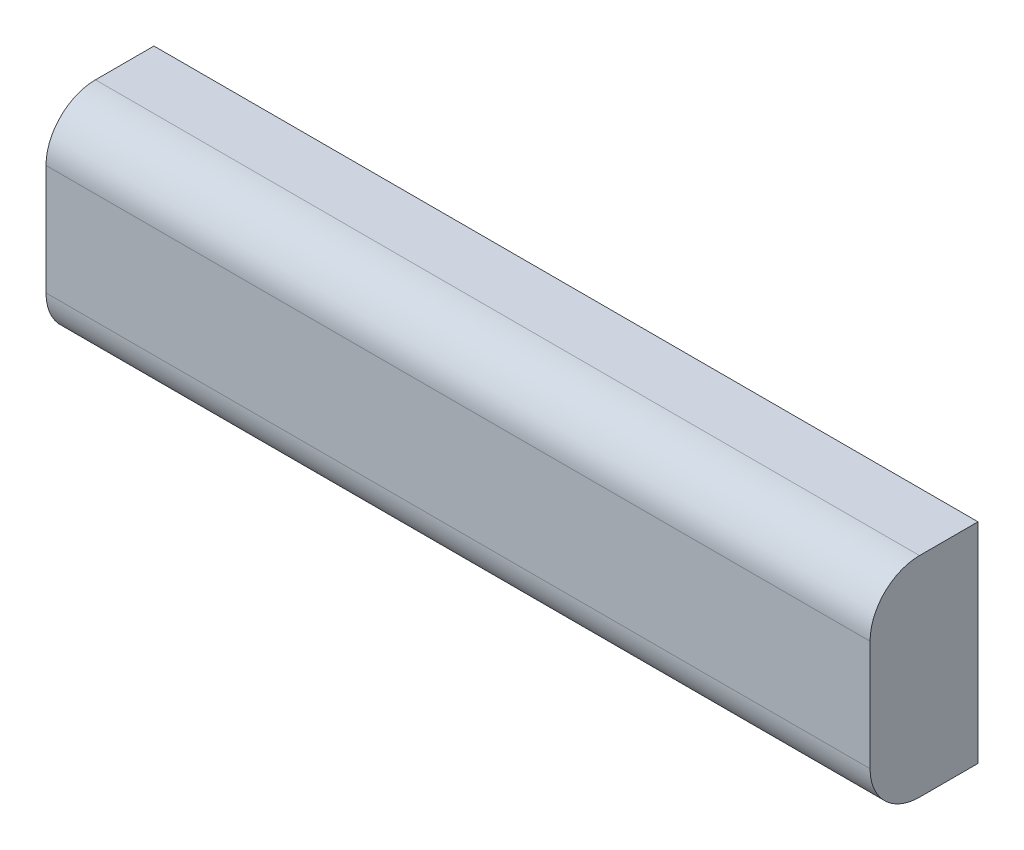
ISO-10303-21;
HEADER;
FILE_DESCRIPTION(('STEP AP214'),'2;1');
FILE_NAME('part.step','',(''),(''),'','','');
FILE_SCHEMA(('AUTOMOTIVE_DESIGN { 1 0 10303 214 1 1 1 1 }'));
ENDSEC;
DATA;
#1=APPLICATION_CONTEXT('core data for automotive mechanical design processes');
#2=APPLICATION_PROTOCOL_DEFINITION('international standard','automotive_design',2000,#1);
#3=PRODUCT_CONTEXT('',#1,'mechanical');
#4=PRODUCT('Part','Part','',(#3));
#5=PRODUCT_RELATED_PRODUCT_CATEGORY('part','',(#4));
#6=PRODUCT_DEFINITION_FORMATION('','',#4);
#7=PRODUCT_DEFINITION_CONTEXT('part definition',#1,'design');
#8=PRODUCT_DEFINITION('design','',#6,#7);
#9=PRODUCT_DEFINITION_SHAPE('','',#8);
#10=(LENGTH_UNIT() NAMED_UNIT(*) SI_UNIT(.MILLI.,.METRE.));
#11=(NAMED_UNIT(*) PLANE_ANGLE_UNIT() SI_UNIT($,.RADIAN.));
#12=(NAMED_UNIT(*) SI_UNIT($,.STERADIAN.) SOLID_ANGLE_UNIT());
#13=UNCERTAINTY_MEASURE_WITH_UNIT(LENGTH_MEASURE(1.E-05),#10,'distance_accuracy_value','');
#14=(GEOMETRIC_REPRESENTATION_CONTEXT(3) GLOBAL_UNCERTAINTY_ASSIGNED_CONTEXT((#13)) GLOBAL_UNIT_ASSIGNED_CONTEXT((#10,
#11,#12)) REPRESENTATION_CONTEXT('',''));
#15=CARTESIAN_POINT('',(0.,0.,0.));
#16=DIRECTION('',(0.,0.,1.));
#17=DIRECTION('',(1.,0.,0.));
#18=AXIS2_PLACEMENT_3D('',#15,#16,#17);
#19=CARTESIAN_POINT('',(-25.,-6.35,6.55));
#20=DIRECTION('',(1.,0.,0.));
#21=DIRECTION('',(0.,0.,-1.));
#22=AXIS2_PLACEMENT_3D('',#19,#20,#21);
#23=PLANE('',#22);
#24=DIRECTION('',(0.,0.,-1.));
#25=VECTOR('',#24,1.);
#26=CARTESIAN_POINT('',(-25.,-6.35,6.55));
#27=LINE('',#26,#25);
#28=CARTESIAN_POINT('',(-25.,-6.35,3.55));
#29=VERTEX_POINT('',#28);
#30=CARTESIAN_POINT('',(-25.,-6.35,0.));
#31=VERTEX_POINT('',#30);
#32=EDGE_CURVE('E176',#29,#31,#27,.T.);
#33=ORIENTED_EDGE('',*,*,#32,.F.);
#34=CARTESIAN_POINT('',(-25.,-3.35,3.55));
#35=DIRECTION('',(1.,0.,0.));
#36=DIRECTION('',(0.,0.,-1.));
#37=AXIS2_PLACEMENT_3D('',#34,#35,#36);
#38=CIRCLE('',#37,3.);
#39=CARTESIAN_POINT('',(-25.,-3.35000000000001,6.55));
#40=VERTEX_POINT('',#39);
#41=EDGE_CURVE('E41',#29,#40,#38,.F.);
#42=ORIENTED_EDGE('',*,*,#41,.T.);
#43=DIRECTION('',(0.,-1.,0.));
#44=VECTOR('',#43,1.);
#45=CARTESIAN_POINT('',(-25.,-6.35,6.55));
#46=LINE('',#45,#44);
#47=CARTESIAN_POINT('',(-25.,3.34999999999999,6.55));
#48=VERTEX_POINT('',#47);
#49=EDGE_CURVE('E153',#48,#40,#46,.T.);
#50=ORIENTED_EDGE('',*,*,#49,.F.);
#51=CARTESIAN_POINT('',(-25.,3.35,3.55));
#52=DIRECTION('',(1.,0.,0.));
#53=DIRECTION('',(0.,0.,-1.));
#54=AXIS2_PLACEMENT_3D('',#51,#52,#53);
#55=CIRCLE('',#54,3.);
#56=CARTESIAN_POINT('',(-25.,6.35,3.55));
#57=VERTEX_POINT('',#56);
#58=EDGE_CURVE('E48',#48,#57,#55,.F.);
#59=ORIENTED_EDGE('',*,*,#58,.T.);
#60=DIRECTION('',(0.,0.,-1.));
#61=VECTOR('',#60,1.);
#62=CARTESIAN_POINT('',(-25.,6.35,6.55));
#63=LINE('',#62,#61);
#64=CARTESIAN_POINT('',(-25.,6.35,0.));
#65=VERTEX_POINT('',#64);
#66=EDGE_CURVE('E160',#57,#65,#63,.T.);
#67=ORIENTED_EDGE('',*,*,#66,.T.);
#68=DIRECTION('',(0.,-1.,0.));
#69=VECTOR('',#68,1.);
#70=CARTESIAN_POINT('',(-25.,-6.35,0.));
#71=LINE('',#70,#69);
#72=EDGE_CURVE('E149',#65,#31,#71,.T.);
#73=ORIENTED_EDGE('',*,*,#72,.T.);
#74=EDGE_LOOP('',(#33,#42,#50,#59,#67,#73));
#75=FACE_BOUND('',#74,.T.);
#76=ADVANCED_FACE('F33',(#75),#23,.F.);
#77=CARTESIAN_POINT('',(25.,-6.35,6.55));
#78=DIRECTION('',(0.,1.,0.));
#79=DIRECTION('',(-1.,0.,0.));
#80=AXIS2_PLACEMENT_3D('',#77,#78,#79);
#81=PLANE('',#80);
#82=DIRECTION('',(0.,0.,-1.));
#83=VECTOR('',#82,1.);
#84=CARTESIAN_POINT('',(25.,-6.35,6.55));
#85=LINE('',#84,#83);
#86=CARTESIAN_POINT('',(25.,-6.35,3.55));
#87=VERTEX_POINT('',#86);
#88=CARTESIAN_POINT('',(25.,-6.35,0.));
#89=VERTEX_POINT('',#88);
#90=EDGE_CURVE('E174',#87,#89,#85,.T.);
#91=ORIENTED_EDGE('',*,*,#90,.F.);
#92=DIRECTION('',(1.,0.,0.));
#93=VECTOR('',#92,1.);
#94=CARTESIAN_POINT('',(-25.,-6.35,3.55));
#95=LINE('',#94,#93);
#96=EDGE_CURVE('E56',#87,#29,#95,.F.);
#97=ORIENTED_EDGE('',*,*,#96,.T.);
#98=ORIENTED_EDGE('',*,*,#32,.T.);
#99=DIRECTION('',(1.,0.,0.));
#100=VECTOR('',#99,1.);
#101=CARTESIAN_POINT('',(25.,-6.35,0.));
#102=LINE('',#101,#100);
#103=EDGE_CURVE('E163',#31,#89,#102,.T.);
#104=ORIENTED_EDGE('',*,*,#103,.T.);
#105=EDGE_LOOP('',(#91,#97,#98,#104));
#106=FACE_BOUND('',#105,.T.);
#107=ADVANCED_FACE('F199',(#106),#81,.F.);
#108=CARTESIAN_POINT('',(25.,-6.35,6.55));
#109=DIRECTION('',(-1.,0.,0.));
#110=DIRECTION('',(0.,0.,1.));
#111=AXIS2_PLACEMENT_3D('',#108,#109,#110);
#112=PLANE('',#111);
#113=DIRECTION('',(0.,1.,0.));
#114=VECTOR('',#113,1.);
#115=CARTESIAN_POINT('',(25.,-6.35,6.55));
#116=LINE('',#115,#114);
#117=CARTESIAN_POINT('',(25.,-3.35,6.55));
#118=VERTEX_POINT('',#117);
#119=CARTESIAN_POINT('',(25.,3.35,6.55));
#120=VERTEX_POINT('',#119);
#121=EDGE_CURVE('E156',#118,#120,#116,.T.);
#122=ORIENTED_EDGE('',*,*,#121,.F.);
#123=CARTESIAN_POINT('',(25.,-3.35,3.55));
#124=DIRECTION('',(-1.,0.,0.));
#125=DIRECTION('',(0.,0.,1.));
#126=AXIS2_PLACEMENT_3D('',#123,#124,#125);
#127=CIRCLE('',#126,3.);
#128=EDGE_CURVE('E186',#118,#87,#127,.F.);
#129=ORIENTED_EDGE('',*,*,#128,.T.);
#130=ORIENTED_EDGE('',*,*,#90,.T.);
#131=DIRECTION('',(0.,1.,0.));
#132=VECTOR('',#131,1.);
#133=CARTESIAN_POINT('',(25.,-6.35,0.));
#134=LINE('',#133,#132);
#135=CARTESIAN_POINT('',(25.,6.35,0.));
#136=VERTEX_POINT('',#135);
#137=EDGE_CURVE('E166',#89,#136,#134,.T.);
#138=ORIENTED_EDGE('',*,*,#137,.T.);
#139=DIRECTION('',(0.,0.,-1.));
#140=VECTOR('',#139,1.);
#141=CARTESIAN_POINT('',(25.,6.35,6.55));
#142=LINE('',#141,#140);
#143=CARTESIAN_POINT('',(25.,6.35,3.55));
#144=VERTEX_POINT('',#143);
#145=EDGE_CURVE('E172',#144,#136,#142,.T.);
#146=ORIENTED_EDGE('',*,*,#145,.F.);
#147=CARTESIAN_POINT('',(25.,3.35,3.55));
#148=DIRECTION('',(-1.,0.,0.));
#149=DIRECTION('',(0.,0.,1.));
#150=AXIS2_PLACEMENT_3D('',#147,#148,#149);
#151=CIRCLE('',#150,3.);
#152=EDGE_CURVE('E184',#144,#120,#151,.F.);
#153=ORIENTED_EDGE('',*,*,#152,.T.);
#154=EDGE_LOOP('',(#122,#129,#130,#138,#146,#153));
#155=FACE_BOUND('',#154,.T.);
#156=ADVANCED_FACE('F198',(#155),#112,.F.);
#157=CARTESIAN_POINT('',(25.,6.35,6.55));
#158=DIRECTION('',(0.,-1.,0.));
#159=DIRECTION('',(1.,0.,0.));
#160=AXIS2_PLACEMENT_3D('',#157,#158,#159);
#161=PLANE('',#160);
#162=ORIENTED_EDGE('',*,*,#66,.F.);
#163=DIRECTION('',(-1.,0.,0.));
#164=VECTOR('',#163,1.);
#165=CARTESIAN_POINT('',(25.,6.35,3.55));
#166=LINE('',#165,#164);
#167=EDGE_CURVE('E11',#57,#144,#166,.F.);
#168=ORIENTED_EDGE('',*,*,#167,.T.);
#169=ORIENTED_EDGE('',*,*,#145,.T.);
#170=DIRECTION('',(-1.,0.,0.));
#171=VECTOR('',#170,1.);
#172=CARTESIAN_POINT('',(25.,6.35,0.));
#173=LINE('',#172,#171);
#174=EDGE_CURVE('E157',#136,#65,#173,.T.);
#175=ORIENTED_EDGE('',*,*,#174,.T.);
#176=EDGE_LOOP('',(#162,#168,#169,#175));
#177=FACE_BOUND('',#176,.T.);
#178=ADVANCED_FACE('F211',(#177),#161,.F.);
#179=CARTESIAN_POINT('',(0.,0.,6.55));
#180=DIRECTION('',(0.,0.,1.));
#181=DIRECTION('',(1.,0.,0.));
#182=AXIS2_PLACEMENT_3D('',#179,#180,#181);
#183=PLANE('',#182);
#184=ORIENTED_EDGE('',*,*,#49,.T.);
#185=DIRECTION('',(1.,0.,0.));
#186=VECTOR('',#185,1.);
#187=CARTESIAN_POINT('',(25.,-3.35,6.55));
#188=LINE('',#187,#186);
#189=EDGE_CURVE('E181',#40,#118,#188,.T.);
#190=ORIENTED_EDGE('',*,*,#189,.T.);
#191=ORIENTED_EDGE('',*,*,#121,.T.);
#192=DIRECTION('',(-1.,0.,0.));
#193=VECTOR('',#192,1.);
#194=CARTESIAN_POINT('',(-25.,3.35,6.55));
#195=LINE('',#194,#193);
#196=EDGE_CURVE('E178',#120,#48,#195,.T.);
#197=ORIENTED_EDGE('',*,*,#196,.T.);
#198=EDGE_LOOP('',(#184,#190,#191,#197));
#199=FACE_BOUND('',#198,.T.);
#200=ADVANCED_FACE('F193',(#199),#183,.T.);
#201=CARTESIAN_POINT('',(0.,0.,0.));
#202=DIRECTION('',(0.,0.,1.));
#203=DIRECTION('',(1.,0.,0.));
#204=AXIS2_PLACEMENT_3D('',#201,#202,#203);
#205=PLANE('',#204);
#206=DIRECTION('',(-1.,0.,0.));
#207=VECTOR('',#206,1.);
#208=CARTESIAN_POINT('',(-24.,-3.16,0.));
#209=LINE('',#208,#207);
#210=CARTESIAN_POINT('',(24.,-3.16,0.));
#211=VERTEX_POINT('',#210);
#212=CARTESIAN_POINT('',(-24.,-3.16,0.));
#213=VERTEX_POINT('',#212);
#214=EDGE_CURVE('E143',#211,#213,#209,.T.);
#215=ORIENTED_EDGE('',*,*,#214,.F.);
#216=DIRECTION('',(0.,-1.,0.));
#217=VECTOR('',#216,1.);
#218=CARTESIAN_POINT('',(24.,-3.16,0.));
#219=LINE('',#218,#217);
#220=CARTESIAN_POINT('',(24.,3.16,0.));
#221=VERTEX_POINT('',#220);
#222=EDGE_CURVE('E117',#221,#211,#219,.T.);
#223=ORIENTED_EDGE('',*,*,#222,.F.);
#224=DIRECTION('',(1.,0.,0.));
#225=VECTOR('',#224,1.);
#226=CARTESIAN_POINT('',(-24.,3.16,0.));
#227=LINE('',#226,#225);
#228=CARTESIAN_POINT('',(-24.,3.16,0.));
#229=VERTEX_POINT('',#228);
#230=EDGE_CURVE('E134',#229,#221,#227,.T.);
#231=ORIENTED_EDGE('',*,*,#230,.F.);
#232=DIRECTION('',(0.,1.,0.));
#233=VECTOR('',#232,1.);
#234=CARTESIAN_POINT('',(-24.,-3.16,0.));
#235=LINE('',#234,#233);
#236=EDGE_CURVE('E137',#213,#229,#235,.T.);
#237=ORIENTED_EDGE('',*,*,#236,.F.);
#238=EDGE_LOOP('',(#215,#223,#231,#237));
#239=FACE_BOUND('',#238,.T.);
#240=ORIENTED_EDGE('',*,*,#72,.F.);
#241=ORIENTED_EDGE('',*,*,#174,.F.);
#242=ORIENTED_EDGE('',*,*,#137,.F.);
#243=ORIENTED_EDGE('',*,*,#103,.F.);
#244=EDGE_LOOP('',(#240,#241,#242,#243));
#245=FACE_BOUND('',#244,.T.);
#246=ADVANCED_FACE('F205',(#239,#245),#205,.F.);
#247=CARTESIAN_POINT('',(24.,-3.16,6.35));
#248=DIRECTION('',(1.,0.,0.));
#249=DIRECTION('',(0.,0.,-1.));
#250=AXIS2_PLACEMENT_3D('',#247,#248,#249);
#251=PLANE('',#250);
#252=ORIENTED_EDGE('',*,*,#222,.T.);
#253=DIRECTION('',(0.,0.,-1.));
#254=VECTOR('',#253,1.);
#255=CARTESIAN_POINT('',(24.,-3.16,6.35));
#256=LINE('',#255,#254);
#257=CARTESIAN_POINT('',(24.,-3.16,6.35));
#258=VERTEX_POINT('',#257);
#259=EDGE_CURVE('E110',#258,#211,#256,.T.);
#260=ORIENTED_EDGE('',*,*,#259,.F.);
#261=DIRECTION('',(0.,-1.,0.));
#262=VECTOR('',#261,1.);
#263=CARTESIAN_POINT('',(24.,-3.16,6.35));
#264=LINE('',#263,#262);
#265=CARTESIAN_POINT('',(24.,3.16,6.35));
#266=VERTEX_POINT('',#265);
#267=EDGE_CURVE('E114',#266,#258,#264,.T.);
#268=ORIENTED_EDGE('',*,*,#267,.F.);
#269=DIRECTION('',(0.,0.,-1.));
#270=VECTOR('',#269,1.);
#271=CARTESIAN_POINT('',(24.,3.16,6.35));
#272=LINE('',#271,#270);
#273=EDGE_CURVE('E147',#266,#221,#272,.T.);
#274=ORIENTED_EDGE('',*,*,#273,.T.);
#275=EDGE_LOOP('',(#252,#260,#268,#274));
#276=FACE_BOUND('',#275,.T.);
#277=ADVANCED_FACE('F112',(#276),#251,.F.);
#278=CARTESIAN_POINT('',(-24.,3.16,6.35));
#279=DIRECTION('',(0.,1.,0.));
#280=DIRECTION('',(-1.,0.,0.));
#281=AXIS2_PLACEMENT_3D('',#278,#279,#280);
#282=PLANE('',#281);
#283=ORIENTED_EDGE('',*,*,#230,.T.);
#284=ORIENTED_EDGE('',*,*,#273,.F.);
#285=DIRECTION('',(1.,0.,0.));
#286=VECTOR('',#285,1.);
#287=CARTESIAN_POINT('',(-24.,3.16,6.35));
#288=LINE('',#287,#286);
#289=CARTESIAN_POINT('',(-24.,3.16,6.35));
#290=VERTEX_POINT('',#289);
#291=EDGE_CURVE('E122',#290,#266,#288,.T.);
#292=ORIENTED_EDGE('',*,*,#291,.F.);
#293=DIRECTION('',(0.,0.,-1.));
#294=VECTOR('',#293,1.);
#295=CARTESIAN_POINT('',(-24.,3.16,6.35));
#296=LINE('',#295,#294);
#297=EDGE_CURVE('E150',#290,#229,#296,.T.);
#298=ORIENTED_EDGE('',*,*,#297,.T.);
#299=EDGE_LOOP('',(#283,#284,#292,#298));
#300=FACE_BOUND('',#299,.T.);
#301=ADVANCED_FACE('F239',(#300),#282,.F.);
#302=CARTESIAN_POINT('',(-24.,-3.16,6.35));
#303=DIRECTION('',(-1.,0.,0.));
#304=DIRECTION('',(0.,0.,1.));
#305=AXIS2_PLACEMENT_3D('',#302,#303,#304);
#306=PLANE('',#305);
#307=ORIENTED_EDGE('',*,*,#236,.T.);
#308=ORIENTED_EDGE('',*,*,#297,.F.);
#309=DIRECTION('',(0.,1.,0.));
#310=VECTOR('',#309,1.);
#311=CARTESIAN_POINT('',(-24.,-3.16,6.35));
#312=LINE('',#311,#310);
#313=CARTESIAN_POINT('',(-24.,-3.16,6.35));
#314=VERTEX_POINT('',#313);
#315=EDGE_CURVE('E130',#314,#290,#312,.T.);
#316=ORIENTED_EDGE('',*,*,#315,.F.);
#317=DIRECTION('',(0.,0.,-1.));
#318=VECTOR('',#317,1.);
#319=CARTESIAN_POINT('',(-24.,-3.16,6.35));
#320=LINE('',#319,#318);
#321=EDGE_CURVE('E121',#314,#213,#320,.T.);
#322=ORIENTED_EDGE('',*,*,#321,.T.);
#323=EDGE_LOOP('',(#307,#308,#316,#322));
#324=FACE_BOUND('',#323,.T.);
#325=ADVANCED_FACE('F236',(#324),#306,.F.);
#326=CARTESIAN_POINT('',(-24.,-3.16,6.35));
#327=DIRECTION('',(0.,-1.,0.));
#328=DIRECTION('',(1.,0.,0.));
#329=AXIS2_PLACEMENT_3D('',#326,#327,#328);
#330=PLANE('',#329);
#331=ORIENTED_EDGE('',*,*,#214,.T.);
#332=ORIENTED_EDGE('',*,*,#321,.F.);
#333=DIRECTION('',(-1.,0.,0.));
#334=VECTOR('',#333,1.);
#335=CARTESIAN_POINT('',(-24.,-3.16,6.35));
#336=LINE('',#335,#334);
#337=EDGE_CURVE('E125',#258,#314,#336,.T.);
#338=ORIENTED_EDGE('',*,*,#337,.F.);
#339=ORIENTED_EDGE('',*,*,#259,.T.);
#340=EDGE_LOOP('',(#331,#332,#338,#339));
#341=FACE_BOUND('',#340,.T.);
#342=ADVANCED_FACE('F126',(#341),#330,.F.);
#343=CARTESIAN_POINT('',(0.,0.,6.35));
#344=DIRECTION('',(0.,0.,-1.));
#345=DIRECTION('',(-1.,0.,0.));
#346=AXIS2_PLACEMENT_3D('',#343,#344,#345);
#347=PLANE('',#346);
#348=ORIENTED_EDGE('',*,*,#267,.T.);
#349=ORIENTED_EDGE('',*,*,#337,.T.);
#350=ORIENTED_EDGE('',*,*,#315,.T.);
#351=ORIENTED_EDGE('',*,*,#291,.T.);
#352=EDGE_LOOP('',(#348,#349,#350,#351));
#353=FACE_BOUND('',#352,.T.);
#354=ADVANCED_FACE('F132',(#353),#347,.T.);
#355=CARTESIAN_POINT('',(0.,-3.35,3.55));
#356=DIRECTION('',(-1.,0.,0.));
#357=DIRECTION('',(0.,-1.,0.));
#358=AXIS2_PLACEMENT_3D('',#355,#356,#357);
#359=CYLINDRICAL_SURFACE('',#358,3.);
#360=ORIENTED_EDGE('',*,*,#41,.F.);
#361=ORIENTED_EDGE('',*,*,#96,.F.);
#362=ORIENTED_EDGE('',*,*,#128,.F.);
#363=ORIENTED_EDGE('',*,*,#189,.F.);
#364=EDGE_LOOP('',(#360,#361,#362,#363));
#365=FACE_BOUND('',#364,.T.);
#366=ADVANCED_FACE('F196',(#365),#359,.T.);
#367=CARTESIAN_POINT('',(0.,3.35,3.55));
#368=DIRECTION('',(1.,0.,0.));
#369=DIRECTION('',(0.,1.,0.));
#370=AXIS2_PLACEMENT_3D('',#367,#368,#369);
#371=CYLINDRICAL_SURFACE('',#370,3.);
#372=ORIENTED_EDGE('',*,*,#152,.F.);
#373=ORIENTED_EDGE('',*,*,#167,.F.);
#374=ORIENTED_EDGE('',*,*,#58,.F.);
#375=ORIENTED_EDGE('',*,*,#196,.F.);
#376=EDGE_LOOP('',(#372,#373,#374,#375));
#377=FACE_BOUND('',#376,.T.);
#378=ADVANCED_FACE('F35',(#377),#371,.T.);
#379=CLOSED_SHELL('',(#76,#107,#156,#178,#200,#246,#277,#301,#325,#342,#354,#366,#378));
#380=MANIFOLD_SOLID_BREP('B2',#379);
#381=ADVANCED_BREP_SHAPE_REPRESENTATION('',(#18,#380),#14);
#382=SHAPE_DEFINITION_REPRESENTATION(#9,#381);
ENDSEC;
END-ISO-10303-21;
